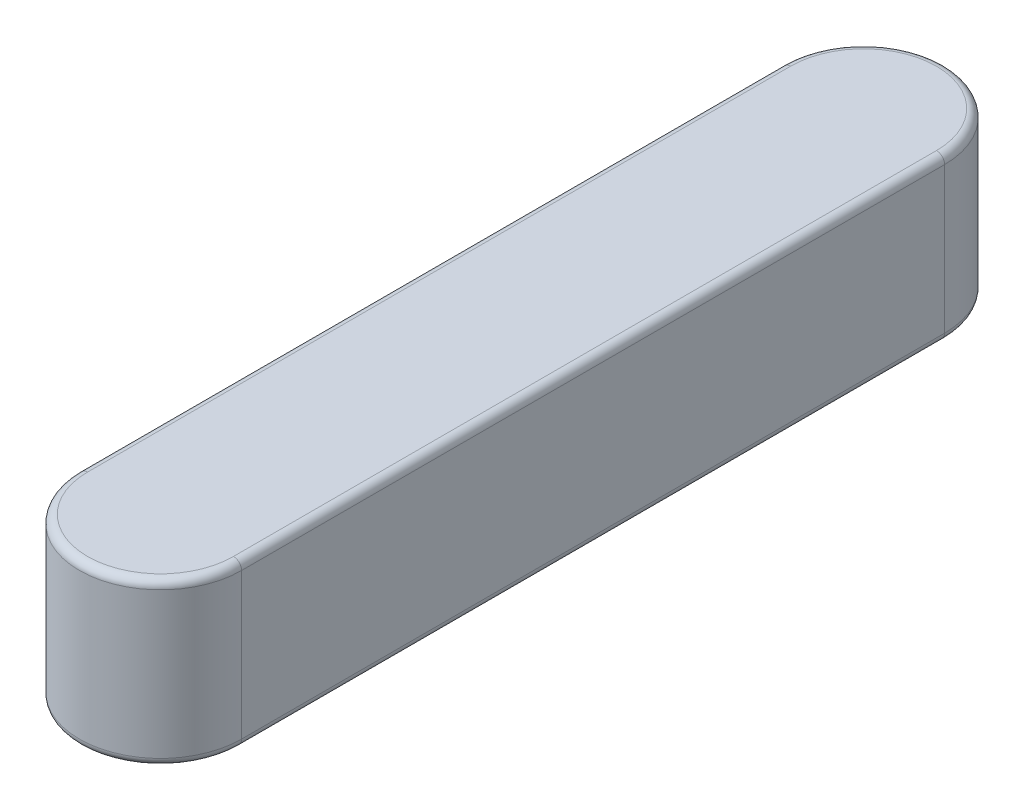
ISO-10303-21;
HEADER;
FILE_DESCRIPTION(('STEP AP214'),'2;1');
FILE_NAME('part.step','',(''),(''),'','','');
FILE_SCHEMA(('AUTOMOTIVE_DESIGN { 1 0 10303 214 1 1 1 1 }'));
ENDSEC;
DATA;
#1=APPLICATION_CONTEXT('core data for automotive mechanical design processes');
#2=APPLICATION_PROTOCOL_DEFINITION('international standard','automotive_design',2000,#1);
#3=PRODUCT_CONTEXT('',#1,'mechanical');
#4=PRODUCT('Part','Part','',(#3));
#5=PRODUCT_RELATED_PRODUCT_CATEGORY('part','',(#4));
#6=PRODUCT_DEFINITION_FORMATION('','',#4);
#7=PRODUCT_DEFINITION_CONTEXT('part definition',#1,'design');
#8=PRODUCT_DEFINITION('design','',#6,#7);
#9=PRODUCT_DEFINITION_SHAPE('','',#8);
#10=(LENGTH_UNIT() NAMED_UNIT(*) SI_UNIT(.MILLI.,.METRE.));
#11=(NAMED_UNIT(*) PLANE_ANGLE_UNIT() SI_UNIT($,.RADIAN.));
#12=(NAMED_UNIT(*) SI_UNIT($,.STERADIAN.) SOLID_ANGLE_UNIT());
#13=UNCERTAINTY_MEASURE_WITH_UNIT(LENGTH_MEASURE(1.E-05),#10,'distance_accuracy_value','');
#14=(GEOMETRIC_REPRESENTATION_CONTEXT(3) GLOBAL_UNCERTAINTY_ASSIGNED_CONTEXT((#13)) GLOBAL_UNIT_ASSIGNED_CONTEXT((#10,
#11,#12)) REPRESENTATION_CONTEXT('',''));
#15=CARTESIAN_POINT('',(0.,0.,0.));
#16=DIRECTION('',(0.,0.,1.));
#17=DIRECTION('',(1.,0.,0.));
#18=AXIS2_PLACEMENT_3D('',#15,#16,#17);
#19=CARTESIAN_POINT('',(0.,-2.38125,-10.31875));
#20=DIRECTION('',(0.,1.,0.));
#21=DIRECTION('',(0.,0.,1.));
#22=AXIS2_PLACEMENT_3D('',#19,#20,#21);
#23=CYLINDRICAL_SURFACE('',#22,2.38125);
#24=DIRECTION('',(0.,1.,0.));
#25=VECTOR('',#24,1.);
#26=CARTESIAN_POINT('',(2.38125,-2.38125,-10.31875));
#27=LINE('',#26,#25);
#28=CARTESIAN_POINT('',(2.38125,-2.143125,-10.31875));
#29=VERTEX_POINT('',#28);
#30=CARTESIAN_POINT('',(2.38125,2.143125,-10.31875));
#31=VERTEX_POINT('',#30);
#32=EDGE_CURVE('E123',#29,#31,#27,.T.);
#33=ORIENTED_EDGE('',*,*,#32,.F.);
#34=CARTESIAN_POINT('',(0.,-2.143125,-10.31875));
#35=DIRECTION('',(0.,-1.,0.));
#36=DIRECTION('',(0.,0.,-1.));
#37=AXIS2_PLACEMENT_3D('',#34,#35,#36);
#38=CIRCLE('',#37,2.38125);
#39=CARTESIAN_POINT('',(-2.38125,-2.143125,-10.31875));
#40=VERTEX_POINT('',#39);
#41=EDGE_CURVE('E118',#29,#40,#38,.F.);
#42=ORIENTED_EDGE('',*,*,#41,.T.);
#43=DIRECTION('',(0.,1.,0.));
#44=VECTOR('',#43,1.);
#45=CARTESIAN_POINT('',(-2.38125,-2.38125,-10.31875));
#46=LINE('',#45,#44);
#47=CARTESIAN_POINT('',(-2.38125,2.143125,-10.31875));
#48=VERTEX_POINT('',#47);
#49=EDGE_CURVE('E120',#40,#48,#46,.T.);
#50=ORIENTED_EDGE('',*,*,#49,.T.);
#51=CARTESIAN_POINT('',(0.,2.143125,-10.31875));
#52=DIRECTION('',(0.,-1.,0.));
#53=DIRECTION('',(0.,0.,-1.));
#54=AXIS2_PLACEMENT_3D('',#51,#52,#53);
#55=CIRCLE('',#54,2.38125);
#56=EDGE_CURVE('E130',#48,#31,#55,.T.);
#57=ORIENTED_EDGE('',*,*,#56,.T.);
#58=EDGE_LOOP('',(#33,#42,#50,#57));
#59=FACE_BOUND('',#58,.T.);
#60=ADVANCED_FACE('F51',(#59),#23,.T.);
#61=CARTESIAN_POINT('',(2.38125,-2.38125,-10.31875));
#62=DIRECTION('',(1.,0.,0.));
#63=DIRECTION('',(0.,0.,-1.));
#64=AXIS2_PLACEMENT_3D('',#61,#62,#63);
#65=PLANE('',#64);
#66=DIRECTION('',(0.,1.,0.));
#67=VECTOR('',#66,1.);
#68=CARTESIAN_POINT('',(2.38125,-2.38125,10.31875));
#69=LINE('',#68,#67);
#70=CARTESIAN_POINT('',(2.38125,-2.143125,10.31875));
#71=VERTEX_POINT('',#70);
#72=CARTESIAN_POINT('',(2.38125,2.143125,10.31875));
#73=VERTEX_POINT('',#72);
#74=EDGE_CURVE('E232',#71,#73,#69,.T.);
#75=ORIENTED_EDGE('',*,*,#74,.F.);
#76=DIRECTION('',(0.,0.,-1.));
#77=VECTOR('',#76,1.);
#78=CARTESIAN_POINT('',(2.38125,-2.143125,-10.31875));
#79=LINE('',#78,#77);
#80=EDGE_CURVE('E186',#71,#29,#79,.T.);
#81=ORIENTED_EDGE('',*,*,#80,.T.);
#82=ORIENTED_EDGE('',*,*,#32,.T.);
#83=DIRECTION('',(0.,0.,-1.));
#84=VECTOR('',#83,1.);
#85=CARTESIAN_POINT('',(2.38125,2.143125,10.31875));
#86=LINE('',#85,#84);
#87=EDGE_CURVE('E182',#31,#73,#86,.F.);
#88=ORIENTED_EDGE('',*,*,#87,.T.);
#89=EDGE_LOOP('',(#75,#81,#82,#88));
#90=FACE_BOUND('',#89,.T.);
#91=ADVANCED_FACE('F228',(#90),#65,.T.);
#92=CARTESIAN_POINT('',(0.,-2.38125,10.31875));
#93=DIRECTION('',(0.,1.,0.));
#94=DIRECTION('',(0.,0.,1.));
#95=AXIS2_PLACEMENT_3D('',#92,#93,#94);
#96=CYLINDRICAL_SURFACE('',#95,2.38125);
#97=DIRECTION('',(0.,1.,0.));
#98=VECTOR('',#97,1.);
#99=CARTESIAN_POINT('',(-2.38125,-2.38125,10.31875));
#100=LINE('',#99,#98);
#101=CARTESIAN_POINT('',(-2.38125,-2.143125,10.31875));
#102=VERTEX_POINT('',#101);
#103=CARTESIAN_POINT('',(-2.38125,2.143125,10.31875));
#104=VERTEX_POINT('',#103);
#105=EDGE_CURVE('E142',#102,#104,#100,.T.);
#106=ORIENTED_EDGE('',*,*,#105,.F.);
#107=CARTESIAN_POINT('',(0.,-2.143125,10.31875));
#108=DIRECTION('',(0.,-1.,0.));
#109=DIRECTION('',(0.,0.,-1.));
#110=AXIS2_PLACEMENT_3D('',#107,#108,#109);
#111=CIRCLE('',#110,2.38125);
#112=EDGE_CURVE('E179',#102,#71,#111,.F.);
#113=ORIENTED_EDGE('',*,*,#112,.T.);
#114=ORIENTED_EDGE('',*,*,#74,.T.);
#115=CARTESIAN_POINT('',(0.,2.143125,10.31875));
#116=DIRECTION('',(0.,-1.,0.));
#117=DIRECTION('',(0.,0.,-1.));
#118=AXIS2_PLACEMENT_3D('',#115,#116,#117);
#119=CIRCLE('',#118,2.38125);
#120=EDGE_CURVE('E176',#73,#104,#119,.T.);
#121=ORIENTED_EDGE('',*,*,#120,.T.);
#122=EDGE_LOOP('',(#106,#113,#114,#121));
#123=FACE_BOUND('',#122,.T.);
#124=ADVANCED_FACE('F255',(#123),#96,.T.);
#125=CARTESIAN_POINT('',(-2.38125,-2.38125,-10.31875));
#126=DIRECTION('',(-1.,0.,0.));
#127=DIRECTION('',(0.,0.,1.));
#128=AXIS2_PLACEMENT_3D('',#125,#126,#127);
#129=PLANE('',#128);
#130=ORIENTED_EDGE('',*,*,#49,.F.);
#131=DIRECTION('',(0.,0.,1.));
#132=VECTOR('',#131,1.);
#133=CARTESIAN_POINT('',(-2.38125,-2.143125,-10.31875));
#134=LINE('',#133,#132);
#135=EDGE_CURVE('E137',#40,#102,#134,.T.);
#136=ORIENTED_EDGE('',*,*,#135,.T.);
#137=ORIENTED_EDGE('',*,*,#105,.T.);
#138=DIRECTION('',(0.,0.,1.));
#139=VECTOR('',#138,1.);
#140=CARTESIAN_POINT('',(-2.38125,2.143125,-10.31875));
#141=LINE('',#140,#139);
#142=EDGE_CURVE('E140',#104,#48,#141,.F.);
#143=ORIENTED_EDGE('',*,*,#142,.T.);
#144=EDGE_LOOP('',(#130,#136,#137,#143));
#145=FACE_BOUND('',#144,.T.);
#146=ADVANCED_FACE('F134',(#145),#129,.T.);
#147=CARTESIAN_POINT('',(0.,-2.38125,-10.31875));
#148=DIRECTION('',(0.,-1.,0.));
#149=DIRECTION('',(0.,0.,-1.));
#150=AXIS2_PLACEMENT_3D('',#147,#148,#149);
#151=PLANE('',#150);
#152=CARTESIAN_POINT('',(0.,-2.38125,10.31875));
#153=DIRECTION('',(0.,-1.,0.));
#154=DIRECTION('',(0.,0.,-1.));
#155=AXIS2_PLACEMENT_3D('',#152,#153,#154);
#156=CIRCLE('',#155,2.143125);
#157=CARTESIAN_POINT('',(2.143125,-2.38125,10.31875));
#158=VERTEX_POINT('',#157);
#159=CARTESIAN_POINT('',(-2.143125,-2.38125,10.31875));
#160=VERTEX_POINT('',#159);
#161=EDGE_CURVE('E170',#158,#160,#156,.T.);
#162=ORIENTED_EDGE('',*,*,#161,.T.);
#163=DIRECTION('',(0.,0.,1.));
#164=VECTOR('',#163,1.);
#165=CARTESIAN_POINT('',(-2.143125,-2.38125,-10.31875));
#166=LINE('',#165,#164);
#167=CARTESIAN_POINT('',(-2.143125,-2.38125,-10.31875));
#168=VERTEX_POINT('',#167);
#169=EDGE_CURVE('E173',#160,#168,#166,.F.);
#170=ORIENTED_EDGE('',*,*,#169,.T.);
#171=CARTESIAN_POINT('',(0.,-2.38125,-10.31875));
#172=DIRECTION('',(0.,-1.,0.));
#173=DIRECTION('',(0.,0.,-1.));
#174=AXIS2_PLACEMENT_3D('',#171,#172,#173);
#175=CIRCLE('',#174,2.143125);
#176=CARTESIAN_POINT('',(2.143125,-2.38125,-10.31875));
#177=VERTEX_POINT('',#176);
#178=EDGE_CURVE('E148',#168,#177,#175,.T.);
#179=ORIENTED_EDGE('',*,*,#178,.T.);
#180=DIRECTION('',(0.,0.,-1.));
#181=VECTOR('',#180,1.);
#182=CARTESIAN_POINT('',(2.143125,-2.38125,-10.31875));
#183=LINE('',#182,#181);
#184=EDGE_CURVE('E164',#177,#158,#183,.F.);
#185=ORIENTED_EDGE('',*,*,#184,.T.);
#186=EDGE_LOOP('',(#162,#170,#179,#185));
#187=FACE_BOUND('',#186,.T.);
#188=ADVANCED_FACE('F240',(#187),#151,.T.);
#189=CARTESIAN_POINT('',(0.,2.38125,-10.31875));
#190=DIRECTION('',(0.,-1.,0.));
#191=DIRECTION('',(0.,0.,-1.));
#192=AXIS2_PLACEMENT_3D('',#189,#190,#191);
#193=PLANE('',#192);
#194=CARTESIAN_POINT('',(0.,2.38125,10.31875));
#195=DIRECTION('',(0.,-1.,0.));
#196=DIRECTION('',(0.,0.,-1.));
#197=AXIS2_PLACEMENT_3D('',#194,#195,#196);
#198=CIRCLE('',#197,2.143125);
#199=CARTESIAN_POINT('',(-2.143125,2.38125,10.31875));
#200=VERTEX_POINT('',#199);
#201=CARTESIAN_POINT('',(2.143125,2.38125,10.31875));
#202=VERTEX_POINT('',#201);
#203=EDGE_CURVE('E61',#200,#202,#198,.F.);
#204=ORIENTED_EDGE('',*,*,#203,.T.);
#205=DIRECTION('',(0.,0.,-1.));
#206=VECTOR('',#205,1.);
#207=CARTESIAN_POINT('',(2.143125,2.38125,-10.31875));
#208=LINE('',#207,#206);
#209=CARTESIAN_POINT('',(2.143125,2.38125,-10.31875));
#210=VERTEX_POINT('',#209);
#211=EDGE_CURVE('E11',#202,#210,#208,.T.);
#212=ORIENTED_EDGE('',*,*,#211,.T.);
#213=CARTESIAN_POINT('',(0.,2.38125,-10.31875));
#214=DIRECTION('',(0.,-1.,0.));
#215=DIRECTION('',(0.,0.,-1.));
#216=AXIS2_PLACEMENT_3D('',#213,#214,#215);
#217=CIRCLE('',#216,2.143125);
#218=CARTESIAN_POINT('',(-2.143125,2.38125,-10.31875));
#219=VERTEX_POINT('',#218);
#220=EDGE_CURVE('E129',#210,#219,#217,.F.);
#221=ORIENTED_EDGE('',*,*,#220,.T.);
#222=DIRECTION('',(0.,0.,1.));
#223=VECTOR('',#222,1.);
#224=CARTESIAN_POINT('',(-2.143125,2.38125,10.31875));
#225=LINE('',#224,#223);
#226=EDGE_CURVE('E72',#219,#200,#225,.T.);
#227=ORIENTED_EDGE('',*,*,#226,.T.);
#228=EDGE_LOOP('',(#204,#212,#221,#227));
#229=FACE_BOUND('',#228,.T.);
#230=ADVANCED_FACE('F237',(#229),#193,.F.);
#231=CARTESIAN_POINT('',(2.143125,-2.143125,-10.31875));
#232=DIRECTION('',(0.,0.,-1.));
#233=DIRECTION('',(-1.,0.,0.));
#234=AXIS2_PLACEMENT_3D('',#231,#232,#233);
#235=CYLINDRICAL_SURFACE('',#234,0.238125);
#236=CARTESIAN_POINT('',(2.143125,-2.143125,10.31875));
#237=DIRECTION('',(0.,0.,1.));
#238=DIRECTION('',(1.,0.,0.));
#239=AXIS2_PLACEMENT_3D('',#236,#237,#238);
#240=CIRCLE('',#239,0.238125);
#241=EDGE_CURVE('E153',#158,#71,#240,.T.);
#242=ORIENTED_EDGE('',*,*,#241,.F.);
#243=ORIENTED_EDGE('',*,*,#184,.F.);
#244=CARTESIAN_POINT('',(2.143125,-2.143125,-10.31875));
#245=DIRECTION('',(0.,0.,-1.));
#246=DIRECTION('',(-1.,0.,0.));
#247=AXIS2_PLACEMENT_3D('',#244,#245,#246);
#248=CIRCLE('',#247,0.238125);
#249=EDGE_CURVE('E143',#29,#177,#248,.T.);
#250=ORIENTED_EDGE('',*,*,#249,.F.);
#251=ORIENTED_EDGE('',*,*,#80,.F.);
#252=EDGE_LOOP('',(#242,#243,#250,#251));
#253=FACE_BOUND('',#252,.T.);
#254=ADVANCED_FACE('F239',(#253),#235,.T.);
#255=CARTESIAN_POINT('',(0.,-2.143125,-10.31875));
#256=DIRECTION('',(0.,-1.,0.));
#257=DIRECTION('',(0.,0.,-1.));
#258=AXIS2_PLACEMENT_3D('',#255,#256,#257);
#259=TOROIDAL_SURFACE('',#258,2.143125,0.238125);
#260=ORIENTED_EDGE('',*,*,#249,.T.);
#261=ORIENTED_EDGE('',*,*,#178,.F.);
#262=CARTESIAN_POINT('',(-2.143125,-2.143125,-10.31875));
#263=DIRECTION('',(0.,0.,1.));
#264=DIRECTION('',(1.,0.,0.));
#265=AXIS2_PLACEMENT_3D('',#262,#263,#264);
#266=CIRCLE('',#265,0.238125);
#267=EDGE_CURVE('E146',#40,#168,#266,.T.);
#268=ORIENTED_EDGE('',*,*,#267,.F.);
#269=ORIENTED_EDGE('',*,*,#41,.F.);
#270=EDGE_LOOP('',(#260,#261,#268,#269));
#271=FACE_BOUND('',#270,.T.);
#272=ADVANCED_FACE('F147',(#271),#259,.T.);
#273=CARTESIAN_POINT('',(0.,-2.143125,10.31875));
#274=DIRECTION('',(0.,-1.,0.));
#275=DIRECTION('',(0.,0.,-1.));
#276=AXIS2_PLACEMENT_3D('',#273,#274,#275);
#277=TOROIDAL_SURFACE('',#276,2.143125,0.238125);
#278=ORIENTED_EDGE('',*,*,#241,.T.);
#279=ORIENTED_EDGE('',*,*,#112,.F.);
#280=CARTESIAN_POINT('',(-2.143125,-2.143125,10.31875));
#281=DIRECTION('',(0.,0.,-1.));
#282=DIRECTION('',(-1.,0.,0.));
#283=AXIS2_PLACEMENT_3D('',#280,#281,#282);
#284=CIRCLE('',#283,0.238125);
#285=EDGE_CURVE('E154',#160,#102,#284,.T.);
#286=ORIENTED_EDGE('',*,*,#285,.F.);
#287=ORIENTED_EDGE('',*,*,#161,.F.);
#288=EDGE_LOOP('',(#278,#279,#286,#287));
#289=FACE_BOUND('',#288,.T.);
#290=ADVANCED_FACE('F261',(#289),#277,.T.);
#291=CARTESIAN_POINT('',(-2.143125,-2.143125,-10.31875));
#292=DIRECTION('',(0.,0.,1.));
#293=DIRECTION('',(1.,0.,0.));
#294=AXIS2_PLACEMENT_3D('',#291,#292,#293);
#295=CYLINDRICAL_SURFACE('',#294,0.238125);
#296=ORIENTED_EDGE('',*,*,#267,.T.);
#297=ORIENTED_EDGE('',*,*,#169,.F.);
#298=ORIENTED_EDGE('',*,*,#285,.T.);
#299=ORIENTED_EDGE('',*,*,#135,.F.);
#300=EDGE_LOOP('',(#296,#297,#298,#299));
#301=FACE_BOUND('',#300,.T.);
#302=ADVANCED_FACE('F156',(#301),#295,.T.);
#303=CARTESIAN_POINT('',(-2.143125,2.143125,-10.31875));
#304=DIRECTION('',(0.,0.,-1.));
#305=DIRECTION('',(-1.,0.,0.));
#306=AXIS2_PLACEMENT_3D('',#303,#304,#305);
#307=CYLINDRICAL_SURFACE('',#306,0.238125);
#308=CARTESIAN_POINT('',(-2.143125,2.143125,-10.31875));
#309=DIRECTION('',(0.,0.,-1.));
#310=DIRECTION('',(-1.,0.,0.));
#311=AXIS2_PLACEMENT_3D('',#308,#309,#310);
#312=CIRCLE('',#311,0.238125);
#313=EDGE_CURVE('E209',#48,#219,#312,.T.);
#314=ORIENTED_EDGE('',*,*,#313,.F.);
#315=ORIENTED_EDGE('',*,*,#142,.F.);
#316=CARTESIAN_POINT('',(-2.143125,2.143125,10.31875));
#317=DIRECTION('',(0.,0.,1.));
#318=DIRECTION('',(1.,0.,0.));
#319=AXIS2_PLACEMENT_3D('',#316,#317,#318);
#320=CIRCLE('',#319,0.238125);
#321=EDGE_CURVE('E55',#200,#104,#320,.T.);
#322=ORIENTED_EDGE('',*,*,#321,.F.);
#323=ORIENTED_EDGE('',*,*,#226,.F.);
#324=EDGE_LOOP('',(#314,#315,#322,#323));
#325=FACE_BOUND('',#324,.T.);
#326=ADVANCED_FACE('F53',(#325),#307,.T.);
#327=CARTESIAN_POINT('',(0.,2.143125,10.31875));
#328=DIRECTION('',(0.,-1.,0.));
#329=DIRECTION('',(0.,0.,-1.));
#330=AXIS2_PLACEMENT_3D('',#327,#328,#329);
#331=TOROIDAL_SURFACE('',#330,2.143125,0.238125);
#332=ORIENTED_EDGE('',*,*,#321,.T.);
#333=ORIENTED_EDGE('',*,*,#120,.F.);
#334=CARTESIAN_POINT('',(2.143125,2.143125,10.31875));
#335=DIRECTION('',(0.,0.,-1.));
#336=DIRECTION('',(-1.,0.,0.));
#337=AXIS2_PLACEMENT_3D('',#334,#335,#336);
#338=CIRCLE('',#337,0.238125);
#339=EDGE_CURVE('E207',#202,#73,#338,.T.);
#340=ORIENTED_EDGE('',*,*,#339,.F.);
#341=ORIENTED_EDGE('',*,*,#203,.F.);
#342=EDGE_LOOP('',(#332,#333,#340,#341));
#343=FACE_BOUND('',#342,.T.);
#344=ADVANCED_FACE('F221',(#343),#331,.T.);
#345=CARTESIAN_POINT('',(0.,2.143125,-10.31875));
#346=DIRECTION('',(0.,-1.,0.));
#347=DIRECTION('',(0.,0.,-1.));
#348=AXIS2_PLACEMENT_3D('',#345,#346,#347);
#349=TOROIDAL_SURFACE('',#348,2.143125,0.238125);
#350=ORIENTED_EDGE('',*,*,#313,.T.);
#351=ORIENTED_EDGE('',*,*,#220,.F.);
#352=CARTESIAN_POINT('',(2.143125,2.143125,-10.31875));
#353=DIRECTION('',(0.,0.,1.));
#354=DIRECTION('',(1.,0.,0.));
#355=AXIS2_PLACEMENT_3D('',#352,#353,#354);
#356=CIRCLE('',#355,0.238125);
#357=EDGE_CURVE('E204',#31,#210,#356,.T.);
#358=ORIENTED_EDGE('',*,*,#357,.F.);
#359=ORIENTED_EDGE('',*,*,#56,.F.);
#360=EDGE_LOOP('',(#350,#351,#358,#359));
#361=FACE_BOUND('',#360,.T.);
#362=ADVANCED_FACE('F224',(#361),#349,.T.);
#363=CARTESIAN_POINT('',(2.143125,2.143125,-10.31875));
#364=DIRECTION('',(0.,0.,1.));
#365=DIRECTION('',(1.,0.,0.));
#366=AXIS2_PLACEMENT_3D('',#363,#364,#365);
#367=CYLINDRICAL_SURFACE('',#366,0.238125);
#368=ORIENTED_EDGE('',*,*,#339,.T.);
#369=ORIENTED_EDGE('',*,*,#87,.F.);
#370=ORIENTED_EDGE('',*,*,#357,.T.);
#371=ORIENTED_EDGE('',*,*,#211,.F.);
#372=EDGE_LOOP('',(#368,#369,#370,#371));
#373=FACE_BOUND('',#372,.T.);
#374=ADVANCED_FACE('F235',(#373),#367,.T.);
#375=CLOSED_SHELL('',(#60,#91,#124,#146,#188,#230,#254,#272,#290,#302,#326,#344,#362,#374));
#376=MANIFOLD_SOLID_BREP('B2',#375);
#377=ADVANCED_BREP_SHAPE_REPRESENTATION('',(#18,#376),#14);
#378=SHAPE_DEFINITION_REPRESENTATION(#9,#377);
ENDSEC;
END-ISO-10303-21;
